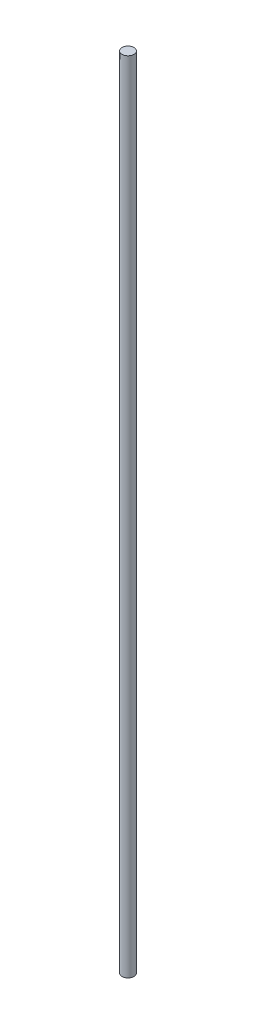
ISO-10303-21;
HEADER;
FILE_DESCRIPTION(('STEP AP214'),'2;1');
FILE_NAME('part.step','',(''),(''),'','','');
FILE_SCHEMA(('AUTOMOTIVE_DESIGN { 1 0 10303 214 1 1 1 1 }'));
ENDSEC;
DATA;
#1=APPLICATION_CONTEXT('core data for automotive mechanical design processes');
#2=APPLICATION_PROTOCOL_DEFINITION('international standard','automotive_design',2000,#1);
#3=PRODUCT_CONTEXT('',#1,'mechanical');
#4=PRODUCT('Part','Part','',(#3));
#5=PRODUCT_RELATED_PRODUCT_CATEGORY('part','',(#4));
#6=PRODUCT_DEFINITION_FORMATION('','',#4);
#7=PRODUCT_DEFINITION_CONTEXT('part definition',#1,'design');
#8=PRODUCT_DEFINITION('design','',#6,#7);
#9=PRODUCT_DEFINITION_SHAPE('','',#8);
#10=(LENGTH_UNIT() NAMED_UNIT(*) SI_UNIT(.MILLI.,.METRE.));
#11=(NAMED_UNIT(*) PLANE_ANGLE_UNIT() SI_UNIT($,.RADIAN.));
#12=(NAMED_UNIT(*) SI_UNIT($,.STERADIAN.) SOLID_ANGLE_UNIT());
#13=UNCERTAINTY_MEASURE_WITH_UNIT(LENGTH_MEASURE(1.E-05),#10,'distance_accuracy_value','');
#14=(GEOMETRIC_REPRESENTATION_CONTEXT(3) GLOBAL_UNCERTAINTY_ASSIGNED_CONTEXT((#13)) GLOBAL_UNIT_ASSIGNED_CONTEXT((#10,
#11,#12)) REPRESENTATION_CONTEXT('',''));
#15=CARTESIAN_POINT('',(0.,0.,0.));
#16=DIRECTION('',(0.,0.,1.));
#17=DIRECTION('',(1.,0.,0.));
#18=AXIS2_PLACEMENT_3D('',#15,#16,#17);
#19=CARTESIAN_POINT('',(0.,200.,0.));
#20=DIRECTION('',(0.,-1.,0.));
#21=DIRECTION('',(0.,0.,-1.));
#22=AXIS2_PLACEMENT_3D('',#19,#20,#21);
#23=CYLINDRICAL_SURFACE('',#22,1.5);
#24=CARTESIAN_POINT('',(0.,200.,0.));
#25=DIRECTION('',(0.,1.,0.));
#26=DIRECTION('',(0.,0.,1.));
#27=AXIS2_PLACEMENT_3D('',#24,#25,#26);
#28=CIRCLE('',#27,1.5);
#29=CARTESIAN_POINT('',(0.,200.,1.5));
#30=VERTEX_POINT('',#29);
#31=EDGE_CURVE('E10',#30,#30,#28,.T.);
#32=ORIENTED_EDGE('',*,*,#31,.F.);
#33=EDGE_LOOP('',(#32));
#34=FACE_BOUND('',#33,.T.);
#35=CARTESIAN_POINT('',(0.,0.,0.));
#36=DIRECTION('',(0.,1.,0.));
#37=DIRECTION('',(0.,0.,1.));
#38=AXIS2_PLACEMENT_3D('',#35,#36,#37);
#39=CIRCLE('',#38,1.5);
#40=CARTESIAN_POINT('',(0.,0.,1.5));
#41=VERTEX_POINT('',#40);
#42=EDGE_CURVE('E44',#41,#41,#39,.T.);
#43=ORIENTED_EDGE('',*,*,#42,.T.);
#44=EDGE_LOOP('',(#43));
#45=FACE_BOUND('',#44,.T.);
#46=ADVANCED_FACE('F41',(#34,#45),#23,.T.);
#47=CARTESIAN_POINT('',(0.,200.,0.));
#48=DIRECTION('',(0.,1.,0.));
#49=DIRECTION('',(0.,0.,1.));
#50=AXIS2_PLACEMENT_3D('',#47,#48,#49);
#51=PLANE('',#50);
#52=ORIENTED_EDGE('',*,*,#31,.T.);
#53=EDGE_LOOP('',(#52));
#54=FACE_BOUND('',#53,.T.);
#55=ADVANCED_FACE('F56',(#54),#51,.T.);
#56=CARTESIAN_POINT('',(0.,0.,0.));
#57=DIRECTION('',(0.,1.,0.));
#58=DIRECTION('',(0.,0.,1.));
#59=AXIS2_PLACEMENT_3D('',#56,#57,#58);
#60=PLANE('',#59);
#61=ORIENTED_EDGE('',*,*,#42,.F.);
#62=EDGE_LOOP('',(#61));
#63=FACE_BOUND('',#62,.T.);
#64=ADVANCED_FACE('F54',(#63),#60,.F.);
#65=CLOSED_SHELL('',(#46,#55,#64));
#66=MANIFOLD_SOLID_BREP('B2',#65);
#67=ADVANCED_BREP_SHAPE_REPRESENTATION('',(#18,#66),#14);
#68=SHAPE_DEFINITION_REPRESENTATION(#9,#67);
ENDSEC;
END-ISO-10303-21;
